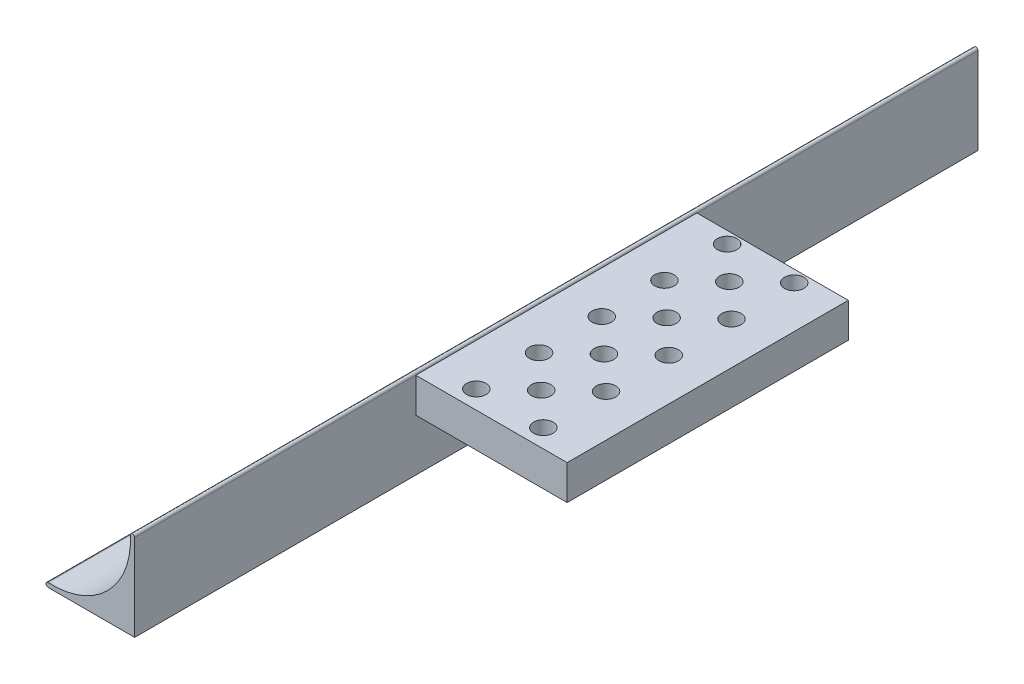
ISO-10303-21;
HEADER;
FILE_DESCRIPTION(('STEP AP214'),'2;1');
FILE_NAME('part.step','',(''),(''),'','','');
FILE_SCHEMA(('AUTOMOTIVE_DESIGN { 1 0 10303 214 1 1 1 1 }'));
ENDSEC;
DATA;
#1=APPLICATION_CONTEXT('core data for automotive mechanical design processes');
#2=APPLICATION_PROTOCOL_DEFINITION('international standard','automotive_design',2000,#1);
#3=PRODUCT_CONTEXT('',#1,'mechanical');
#4=PRODUCT('Part','Part','',(#3));
#5=PRODUCT_RELATED_PRODUCT_CATEGORY('part','',(#4));
#6=PRODUCT_DEFINITION_FORMATION('','',#4);
#7=PRODUCT_DEFINITION_CONTEXT('part definition',#1,'design');
#8=PRODUCT_DEFINITION('design','',#6,#7);
#9=PRODUCT_DEFINITION_SHAPE('','',#8);
#10=(LENGTH_UNIT() NAMED_UNIT(*) SI_UNIT(.MILLI.,.METRE.));
#11=(NAMED_UNIT(*) PLANE_ANGLE_UNIT() SI_UNIT($,.RADIAN.));
#12=(NAMED_UNIT(*) SI_UNIT($,.STERADIAN.) SOLID_ANGLE_UNIT());
#13=UNCERTAINTY_MEASURE_WITH_UNIT(LENGTH_MEASURE(1.E-05),#10,'distance_accuracy_value','');
#14=(GEOMETRIC_REPRESENTATION_CONTEXT(3) GLOBAL_UNCERTAINTY_ASSIGNED_CONTEXT((#13)) GLOBAL_UNIT_ASSIGNED_CONTEXT((#10,
#11,#12)) REPRESENTATION_CONTEXT('',''));
#15=CARTESIAN_POINT('',(0.,0.,0.));
#16=DIRECTION('',(0.,0.,1.));
#17=DIRECTION('',(1.,0.,0.));
#18=AXIS2_PLACEMENT_3D('',#15,#16,#17);
#19=CARTESIAN_POINT('',(0.,0.,97.5));
#20=DIRECTION('',(-1.,0.,0.));
#21=DIRECTION('',(0.,0.,1.));
#22=AXIS2_PLACEMENT_3D('',#19,#20,#21);
#23=PLANE('',#22);
#24=DIRECTION('',(0.,-1.,0.));
#25=VECTOR('',#24,1.);
#26=CARTESIAN_POINT('',(0.,20.,32.5));
#27=LINE('',#26,#25);
#28=CARTESIAN_POINT('',(0.,20.,32.5));
#29=VERTEX_POINT('',#28);
#30=CARTESIAN_POINT('',(0.,12.,32.5));
#31=VERTEX_POINT('',#30);
#32=EDGE_CURVE('E118',#29,#31,#27,.T.);
#33=ORIENTED_EDGE('',*,*,#32,.F.);
#34=DIRECTION('',(0.,0.,-1.));
#35=VECTOR('',#34,1.);
#36=CARTESIAN_POINT('',(0.,20.,97.5));
#37=LINE('',#36,#35);
#38=CARTESIAN_POINT('',(0.,20.,97.5));
#39=VERTEX_POINT('',#38);
#40=EDGE_CURVE('E115',#39,#29,#37,.T.);
#41=ORIENTED_EDGE('',*,*,#40,.F.);
#42=DIRECTION('',(0.,1.,0.));
#43=VECTOR('',#42,1.);
#44=CARTESIAN_POINT('',(0.,0.,97.5));
#45=LINE('',#44,#43);
#46=CARTESIAN_POINT('',(0.,0.,97.5));
#47=VERTEX_POINT('',#46);
#48=EDGE_CURVE('E104',#47,#39,#45,.T.);
#49=ORIENTED_EDGE('',*,*,#48,.F.);
#50=DIRECTION('',(0.,0.,-1.));
#51=VECTOR('',#50,1.);
#52=CARTESIAN_POINT('',(0.,0.,97.5));
#53=LINE('',#52,#51);
#54=CARTESIAN_POINT('',(0.,0.,-97.5));
#55=VERTEX_POINT('',#54);
#56=EDGE_CURVE('E48',#47,#55,#53,.T.);
#57=ORIENTED_EDGE('',*,*,#56,.T.);
#58=DIRECTION('',(0.,1.,0.));
#59=VECTOR('',#58,1.);
#60=CARTESIAN_POINT('',(0.,0.,-97.5));
#61=LINE('',#60,#59);
#62=CARTESIAN_POINT('',(0.,20.,-97.5));
#63=VERTEX_POINT('',#62);
#64=EDGE_CURVE('E136',#55,#63,#61,.T.);
#65=ORIENTED_EDGE('',*,*,#64,.T.);
#66=CARTESIAN_POINT('',(0.,20.,-32.5));
#67=VERTEX_POINT('',#66);
#68=EDGE_CURVE('E121',#67,#63,#37,.T.);
#69=ORIENTED_EDGE('',*,*,#68,.F.);
#70=DIRECTION('',(0.,1.,0.));
#71=VECTOR('',#70,1.);
#72=CARTESIAN_POINT('',(0.,20.,-32.5));
#73=LINE('',#72,#71);
#74=CARTESIAN_POINT('',(0.,12.,-32.5));
#75=VERTEX_POINT('',#74);
#76=EDGE_CURVE('E285',#75,#67,#73,.T.);
#77=ORIENTED_EDGE('',*,*,#76,.F.);
#78=DIRECTION('',(0.,0.,-1.));
#79=VECTOR('',#78,1.);
#80=CARTESIAN_POINT('',(0.,12.,32.5));
#81=LINE('',#80,#79);
#82=EDGE_CURVE('E282',#31,#75,#81,.T.);
#83=ORIENTED_EDGE('',*,*,#82,.F.);
#84=EDGE_LOOP('',(#33,#41,#49,#57,#65,#69,#77,#83));
#85=FACE_BOUND('',#84,.T.);
#86=ADVANCED_FACE('F39',(#85),#23,.F.);
#87=CARTESIAN_POINT('',(-20.,0.5,97.5));
#88=DIRECTION('',(0.,0.,-1.));
#89=DIRECTION('',(-1.,0.,0.));
#90=AXIS2_PLACEMENT_3D('',#87,#88,#89);
#91=CYLINDRICAL_SURFACE('',#90,0.5);
#92=CARTESIAN_POINT('',(-20.,0.5,-97.5));
#93=DIRECTION('',(0.,0.,1.));
#94=DIRECTION('',(1.,0.,0.));
#95=AXIS2_PLACEMENT_3D('',#92,#93,#94);
#96=CIRCLE('',#95,0.5);
#97=CARTESIAN_POINT('',(-19.9721995073313,0.999226534358279,-97.5));
#98=VERTEX_POINT('',#97);
#99=CARTESIAN_POINT('',(-20.,0.,-97.5));
#100=VERTEX_POINT('',#99);
#101=EDGE_CURVE('E130',#98,#100,#96,.T.);
#102=ORIENTED_EDGE('',*,*,#101,.T.);
#103=DIRECTION('',(0.,0.,-1.));
#104=VECTOR('',#103,1.);
#105=CARTESIAN_POINT('',(-20.,0.,97.5));
#106=LINE('',#105,#104);
#107=CARTESIAN_POINT('',(-20.,0.,97.5));
#108=VERTEX_POINT('',#107);
#109=EDGE_CURVE('E11',#108,#100,#106,.T.);
#110=ORIENTED_EDGE('',*,*,#109,.F.);
#111=CARTESIAN_POINT('',(-20.,0.5,97.5));
#112=DIRECTION('',(0.,0.,1.));
#113=DIRECTION('',(1.,0.,0.));
#114=AXIS2_PLACEMENT_3D('',#111,#112,#113);
#115=CIRCLE('',#114,0.5);
#116=CARTESIAN_POINT('',(-19.9721995073313,0.999226534358279,97.5));
#117=VERTEX_POINT('',#116);
#118=EDGE_CURVE('E142',#117,#108,#115,.T.);
#119=ORIENTED_EDGE('',*,*,#118,.F.);
#120=DIRECTION('',(0.,0.,-1.));
#121=VECTOR('',#120,1.);
#122=CARTESIAN_POINT('',(-19.9721995073313,0.999226534358279,97.5));
#123=LINE('',#122,#121);
#124=EDGE_CURVE('E126',#117,#98,#123,.T.);
#125=ORIENTED_EDGE('',*,*,#124,.T.);
#126=EDGE_LOOP('',(#102,#110,#119,#125));
#127=FACE_BOUND('',#126,.T.);
#128=ADVANCED_FACE('F41',(#127),#91,.T.);
#129=CARTESIAN_POINT('',(-20.,0.,97.5));
#130=DIRECTION('',(0.,1.,0.));
#131=DIRECTION('',(0.,0.,1.));
#132=AXIS2_PLACEMENT_3D('',#129,#130,#131);
#133=PLANE('',#132);
#134=DIRECTION('',(1.,0.,0.));
#135=VECTOR('',#134,1.);
#136=CARTESIAN_POINT('',(-20.,0.,-97.5));
#137=LINE('',#136,#135);
#138=EDGE_CURVE('E133',#100,#55,#137,.T.);
#139=ORIENTED_EDGE('',*,*,#138,.T.);
#140=ORIENTED_EDGE('',*,*,#56,.F.);
#141=DIRECTION('',(1.,0.,0.));
#142=VECTOR('',#141,1.);
#143=CARTESIAN_POINT('',(-20.,0.,97.5));
#144=LINE('',#143,#142);
#145=EDGE_CURVE('E97',#108,#47,#144,.T.);
#146=ORIENTED_EDGE('',*,*,#145,.F.);
#147=ORIENTED_EDGE('',*,*,#109,.T.);
#148=EDGE_LOOP('',(#139,#140,#146,#147));
#149=FACE_BOUND('',#148,.T.);
#150=ADVANCED_FACE('F300',(#149),#133,.F.);
#151=CARTESIAN_POINT('',(-0.5,20.,97.5));
#152=DIRECTION('',(0.,0.,-1.));
#153=DIRECTION('',(-1.,0.,0.));
#154=AXIS2_PLACEMENT_3D('',#151,#152,#153);
#155=CYLINDRICAL_SURFACE('',#154,0.5);
#156=CARTESIAN_POINT('',(-0.5,20.,-97.5));
#157=DIRECTION('',(0.,0.,1.));
#158=DIRECTION('',(1.,0.,0.));
#159=AXIS2_PLACEMENT_3D('',#156,#157,#158);
#160=CIRCLE('',#159,0.5);
#161=CARTESIAN_POINT('',(-0.999226534358276,19.9721995073313,-97.5));
#162=VERTEX_POINT('',#161);
#163=EDGE_CURVE('E139',#63,#162,#160,.T.);
#164=ORIENTED_EDGE('',*,*,#163,.T.);
#165=DIRECTION('',(0.,0.,-1.));
#166=VECTOR('',#165,1.);
#167=CARTESIAN_POINT('',(-0.999226534358276,19.9721995073313,97.5));
#168=LINE('',#167,#166);
#169=CARTESIAN_POINT('',(-0.999226534358276,19.9721995073313,97.5));
#170=VERTEX_POINT('',#169);
#171=EDGE_CURVE('E124',#170,#162,#168,.T.);
#172=ORIENTED_EDGE('',*,*,#171,.F.);
#173=CARTESIAN_POINT('',(-0.5,20.,97.5));
#174=DIRECTION('',(0.,0.,1.));
#175=DIRECTION('',(1.,0.,0.));
#176=AXIS2_PLACEMENT_3D('',#173,#174,#175);
#177=CIRCLE('',#176,0.5);
#178=EDGE_CURVE('E108',#39,#170,#177,.T.);
#179=ORIENTED_EDGE('',*,*,#178,.F.);
#180=ORIENTED_EDGE('',*,*,#40,.T.);
#181=DIRECTION('',(0.,0.,1.));
#182=VECTOR('',#181,1.);
#183=CARTESIAN_POINT('',(0.,20.,32.5));
#184=LINE('',#183,#182);
#185=EDGE_CURVE('E271',#67,#29,#184,.T.);
#186=ORIENTED_EDGE('',*,*,#185,.F.);
#187=ORIENTED_EDGE('',*,*,#68,.T.);
#188=EDGE_LOOP('',(#164,#172,#179,#180,#186,#187));
#189=FACE_BOUND('',#188,.T.);
#190=ADVANCED_FACE('F123',(#189),#155,.T.);
#191=CARTESIAN_POINT('',(-18.9713817712562,18.9713817712562,97.5));
#192=DIRECTION('',(0.,0.,-1.));
#193=DIRECTION('',(-1.,0.,0.));
#194=AXIS2_PLACEMENT_3D('',#191,#192,#193);
#195=CYLINDRICAL_SURFACE('',#194,18.);
#196=CARTESIAN_POINT('',(-18.9713817712562,18.9713817712562,-97.5));
#197=DIRECTION('',(0.,0.,-1.));
#198=DIRECTION('',(1.,0.,0.));
#199=AXIS2_PLACEMENT_3D('',#196,#197,#198);
#200=CIRCLE('',#199,18.);
#201=EDGE_CURVE('E89',#162,#98,#200,.T.);
#202=ORIENTED_EDGE('',*,*,#201,.T.);
#203=ORIENTED_EDGE('',*,*,#124,.F.);
#204=CARTESIAN_POINT('',(-18.9713817712562,18.9713817712562,97.5));
#205=DIRECTION('',(0.,0.,-1.));
#206=DIRECTION('',(1.,0.,0.));
#207=AXIS2_PLACEMENT_3D('',#204,#205,#206);
#208=CIRCLE('',#207,18.);
#209=EDGE_CURVE('E65',#170,#117,#208,.T.);
#210=ORIENTED_EDGE('',*,*,#209,.F.);
#211=ORIENTED_EDGE('',*,*,#171,.T.);
#212=EDGE_LOOP('',(#202,#203,#210,#211));
#213=FACE_BOUND('',#212,.T.);
#214=ADVANCED_FACE('F306',(#213),#195,.F.);
#215=CARTESIAN_POINT('',(-20.,0.5,97.5));
#216=DIRECTION('',(0.,0.,1.));
#217=DIRECTION('',(1.,0.,0.));
#218=AXIS2_PLACEMENT_3D('',#215,#216,#217);
#219=PLANE('',#218);
#220=ORIENTED_EDGE('',*,*,#118,.T.);
#221=ORIENTED_EDGE('',*,*,#145,.T.);
#222=ORIENTED_EDGE('',*,*,#48,.T.);
#223=ORIENTED_EDGE('',*,*,#178,.T.);
#224=ORIENTED_EDGE('',*,*,#209,.T.);
#225=EDGE_LOOP('',(#220,#221,#222,#223,#224));
#226=FACE_BOUND('',#225,.T.);
#227=ADVANCED_FACE('F106',(#226),#219,.T.);
#228=CARTESIAN_POINT('',(-20.,0.5,-97.5));
#229=DIRECTION('',(0.,0.,1.));
#230=DIRECTION('',(1.,0.,0.));
#231=AXIS2_PLACEMENT_3D('',#228,#229,#230);
#232=PLANE('',#231);
#233=ORIENTED_EDGE('',*,*,#101,.F.);
#234=ORIENTED_EDGE('',*,*,#201,.F.);
#235=ORIENTED_EDGE('',*,*,#163,.F.);
#236=ORIENTED_EDGE('',*,*,#64,.F.);
#237=ORIENTED_EDGE('',*,*,#138,.F.);
#238=EDGE_LOOP('',(#233,#234,#235,#236,#237));
#239=FACE_BOUND('',#238,.T.);
#240=ADVANCED_FACE('F305',(#239),#232,.F.);
#241=CARTESIAN_POINT('',(35.,20.,32.5));
#242=DIRECTION('',(0.,0.,-1.));
#243=DIRECTION('',(-1.,0.,0.));
#244=AXIS2_PLACEMENT_3D('',#241,#242,#243);
#245=PLANE('',#244);
#246=ORIENTED_EDGE('',*,*,#32,.T.);
#247=DIRECTION('',(-1.,0.,0.));
#248=VECTOR('',#247,1.);
#249=CARTESIAN_POINT('',(35.,12.,32.5));
#250=LINE('',#249,#248);
#251=CARTESIAN_POINT('',(35.,12.,32.5));
#252=VERTEX_POINT('',#251);
#253=EDGE_CURVE('E134',#252,#31,#250,.T.);
#254=ORIENTED_EDGE('',*,*,#253,.F.);
#255=DIRECTION('',(0.,-1.,0.));
#256=VECTOR('',#255,1.);
#257=CARTESIAN_POINT('',(35.,20.,32.5));
#258=LINE('',#257,#256);
#259=CARTESIAN_POINT('',(35.,20.,32.5));
#260=VERTEX_POINT('',#259);
#261=EDGE_CURVE('E267',#260,#252,#258,.T.);
#262=ORIENTED_EDGE('',*,*,#261,.F.);
#263=DIRECTION('',(-1.,0.,0.));
#264=VECTOR('',#263,1.);
#265=CARTESIAN_POINT('',(35.,20.,32.5));
#266=LINE('',#265,#264);
#267=EDGE_CURVE('E280',#260,#29,#266,.T.);
#268=ORIENTED_EDGE('',*,*,#267,.T.);
#269=EDGE_LOOP('',(#246,#254,#262,#268));
#270=FACE_BOUND('',#269,.T.);
#271=ADVANCED_FACE('F352',(#270),#245,.F.);
#272=CARTESIAN_POINT('',(35.,12.,32.5));
#273=DIRECTION('',(0.,1.,0.));
#274=DIRECTION('',(0.,0.,1.));
#275=AXIS2_PLACEMENT_3D('',#272,#273,#274);
#276=PLANE('',#275);
#277=CARTESIAN_POINT('',(9.75000000000002,12.,28.2500000000019));
#278=DIRECTION('',(0.,-1.,0.));
#279=DIRECTION('',(0.,0.,-1.));
#280=AXIS2_PLACEMENT_3D('',#277,#278,#279);
#281=CIRCLE('',#280,2.275);
#282=CARTESIAN_POINT('',(9.75000000000002,12.,25.9750000000019));
#283=VERTEX_POINT('',#282);
#284=EDGE_CURVE('E694',#283,#283,#281,.T.);
#285=ORIENTED_EDGE('',*,*,#284,.F.);
#286=EDGE_LOOP('',(#285));
#287=FACE_BOUND('',#286,.T.);
#288=CARTESIAN_POINT('',(25.25,12.,28.2500000000019));
#289=DIRECTION('',(0.,-1.,0.));
#290=DIRECTION('',(0.,0.,-1.));
#291=AXIS2_PLACEMENT_3D('',#288,#289,#290);
#292=CIRCLE('',#291,2.275);
#293=CARTESIAN_POINT('',(25.25,12.,25.9750000000019));
#294=VERTEX_POINT('',#293);
#295=EDGE_CURVE('E213',#294,#294,#292,.T.);
#296=ORIENTED_EDGE('',*,*,#295,.F.);
#297=EDGE_LOOP('',(#296));
#298=FACE_BOUND('',#297,.T.);
#299=CARTESIAN_POINT('',(25.25,12.,13.7500000000019));
#300=DIRECTION('',(0.,-1.,0.));
#301=DIRECTION('',(0.,0.,-1.));
#302=AXIS2_PLACEMENT_3D('',#299,#300,#301);
#303=CIRCLE('',#302,2.275);
#304=CARTESIAN_POINT('',(25.25,12.,11.4750000000019));
#305=VERTEX_POINT('',#304);
#306=EDGE_CURVE('E206',#305,#305,#303,.T.);
#307=ORIENTED_EDGE('',*,*,#306,.F.);
#308=EDGE_LOOP('',(#307));
#309=FACE_BOUND('',#308,.T.);
#310=CARTESIAN_POINT('',(17.5,12.,21.0000000000019));
#311=DIRECTION('',(0.,-1.,0.));
#312=DIRECTION('',(0.,0.,-1.));
#313=AXIS2_PLACEMENT_3D('',#310,#311,#312);
#314=CIRCLE('',#313,2.275);
#315=CARTESIAN_POINT('',(17.5,12.,18.7250000000019));
#316=VERTEX_POINT('',#315);
#317=EDGE_CURVE('E202',#316,#316,#314,.T.);
#318=ORIENTED_EDGE('',*,*,#317,.F.);
#319=EDGE_LOOP('',(#318));
#320=FACE_BOUND('',#319,.T.);
#321=CARTESIAN_POINT('',(9.75000000000002,12.,13.7500000000018));
#322=DIRECTION('',(0.,-1.,0.));
#323=DIRECTION('',(0.,0.,-1.));
#324=AXIS2_PLACEMENT_3D('',#321,#322,#323);
#325=CIRCLE('',#324,2.275);
#326=CARTESIAN_POINT('',(9.75000000000002,12.,11.4750000000018));
#327=VERTEX_POINT('',#326);
#328=EDGE_CURVE('E198',#327,#327,#325,.T.);
#329=ORIENTED_EDGE('',*,*,#328,.F.);
#330=EDGE_LOOP('',(#329));
#331=FACE_BOUND('',#330,.T.);
#332=CARTESIAN_POINT('',(9.75000000000002,12.,-0.749999999998138));
#333=DIRECTION('',(0.,-1.,0.));
#334=DIRECTION('',(0.,0.,-1.));
#335=AXIS2_PLACEMENT_3D('',#332,#333,#334);
#336=CIRCLE('',#335,2.275);
#337=CARTESIAN_POINT('',(9.75000000000002,12.,-3.02499999999814));
#338=VERTEX_POINT('',#337);
#339=EDGE_CURVE('E193',#338,#338,#336,.T.);
#340=ORIENTED_EDGE('',*,*,#339,.F.);
#341=EDGE_LOOP('',(#340));
#342=FACE_BOUND('',#341,.T.);
#343=CARTESIAN_POINT('',(25.25,12.,-0.749999999998297));
#344=DIRECTION('',(0.,-1.,0.));
#345=DIRECTION('',(0.,0.,-1.));
#346=AXIS2_PLACEMENT_3D('',#343,#344,#345);
#347=CIRCLE('',#346,2.275);
#348=CARTESIAN_POINT('',(25.25,12.,-3.0249999999983));
#349=VERTEX_POINT('',#348);
#350=EDGE_CURVE('E188',#349,#349,#347,.T.);
#351=ORIENTED_EDGE('',*,*,#350,.F.);
#352=EDGE_LOOP('',(#351));
#353=FACE_BOUND('',#352,.T.);
#354=CARTESIAN_POINT('',(17.5000000000001,12.,6.50000000000178));
#355=DIRECTION('',(0.,-1.,0.));
#356=DIRECTION('',(0.,0.,-1.));
#357=AXIS2_PLACEMENT_3D('',#354,#355,#356);
#358=CIRCLE('',#357,2.275);
#359=CARTESIAN_POINT('',(17.5000000000001,12.,4.22500000000178));
#360=VERTEX_POINT('',#359);
#361=EDGE_CURVE('E183',#360,#360,#358,.T.);
#362=ORIENTED_EDGE('',*,*,#361,.F.);
#363=EDGE_LOOP('',(#362));
#364=FACE_BOUND('',#363,.T.);
#365=CARTESIAN_POINT('',(17.5,12.,-7.9999999999983));
#366=DIRECTION('',(0.,-1.,0.));
#367=DIRECTION('',(0.,0.,-1.));
#368=AXIS2_PLACEMENT_3D('',#365,#366,#367);
#369=CIRCLE('',#368,2.275);
#370=CARTESIAN_POINT('',(17.5,12.,-10.2749999999983));
#371=VERTEX_POINT('',#370);
#372=EDGE_CURVE('E178',#371,#371,#369,.T.);
#373=ORIENTED_EDGE('',*,*,#372,.F.);
#374=EDGE_LOOP('',(#373));
#375=FACE_BOUND('',#374,.T.);
#376=CARTESIAN_POINT('',(9.75000000000012,12.,-15.2499999999981));
#377=DIRECTION('',(0.,-1.,0.));
#378=DIRECTION('',(0.,0.,-1.));
#379=AXIS2_PLACEMENT_3D('',#376,#377,#378);
#380=CIRCLE('',#379,2.275);
#381=CARTESIAN_POINT('',(9.75000000000012,12.,-17.5249999999981));
#382=VERTEX_POINT('',#381);
#383=EDGE_CURVE('E173',#382,#382,#380,.T.);
#384=ORIENTED_EDGE('',*,*,#383,.F.);
#385=EDGE_LOOP('',(#384));
#386=FACE_BOUND('',#385,.T.);
#387=CARTESIAN_POINT('',(25.2500000000002,12.,-15.2499999999981));
#388=DIRECTION('',(0.,-1.,0.));
#389=DIRECTION('',(0.,0.,-1.));
#390=AXIS2_PLACEMENT_3D('',#387,#388,#389);
#391=CIRCLE('',#390,2.275);
#392=CARTESIAN_POINT('',(25.2500000000002,12.,-17.5249999999981));
#393=VERTEX_POINT('',#392);
#394=EDGE_CURVE('E168',#393,#393,#391,.T.);
#395=ORIENTED_EDGE('',*,*,#394,.F.);
#396=EDGE_LOOP('',(#395));
#397=FACE_BOUND('',#396,.T.);
#398=CARTESIAN_POINT('',(9.75000000000002,12.,-29.7499999999981));
#399=DIRECTION('',(0.,-1.,0.));
#400=DIRECTION('',(0.,0.,-1.));
#401=AXIS2_PLACEMENT_3D('',#398,#399,#400);
#402=CIRCLE('',#401,2.275);
#403=CARTESIAN_POINT('',(9.75000000000002,12.,-32.0249999999981));
#404=VERTEX_POINT('',#403);
#405=EDGE_CURVE('E163',#404,#404,#402,.T.);
#406=ORIENTED_EDGE('',*,*,#405,.F.);
#407=EDGE_LOOP('',(#406));
#408=FACE_BOUND('',#407,.T.);
#409=CARTESIAN_POINT('',(17.5,12.,-22.4999999999981));
#410=DIRECTION('',(0.,-1.,0.));
#411=DIRECTION('',(0.,0.,-1.));
#412=AXIS2_PLACEMENT_3D('',#409,#410,#411);
#413=CIRCLE('',#412,2.275);
#414=CARTESIAN_POINT('',(17.5,12.,-24.7749999999981));
#415=VERTEX_POINT('',#414);
#416=EDGE_CURVE('E158',#415,#415,#413,.T.);
#417=ORIENTED_EDGE('',*,*,#416,.F.);
#418=EDGE_LOOP('',(#417));
#419=FACE_BOUND('',#418,.T.);
#420=CARTESIAN_POINT('',(25.2500000000001,12.,-29.7499999999981));
#421=DIRECTION('',(0.,-1.,0.));
#422=DIRECTION('',(0.,0.,-1.));
#423=AXIS2_PLACEMENT_3D('',#420,#421,#422);
#424=CIRCLE('',#423,2.275);
#425=CARTESIAN_POINT('',(25.2500000000001,12.,-32.0249999999981));
#426=VERTEX_POINT('',#425);
#427=EDGE_CURVE('E153',#426,#426,#424,.T.);
#428=ORIENTED_EDGE('',*,*,#427,.F.);
#429=EDGE_LOOP('',(#428));
#430=FACE_BOUND('',#429,.T.);
#431=ORIENTED_EDGE('',*,*,#82,.T.);
#432=DIRECTION('',(-1.,0.,0.));
#433=VECTOR('',#432,1.);
#434=CARTESIAN_POINT('',(35.,12.,-32.5));
#435=LINE('',#434,#433);
#436=CARTESIAN_POINT('',(35.,12.,-32.5));
#437=VERTEX_POINT('',#436);
#438=EDGE_CURVE('E291',#437,#75,#435,.T.);
#439=ORIENTED_EDGE('',*,*,#438,.F.);
#440=DIRECTION('',(0.,0.,-1.));
#441=VECTOR('',#440,1.);
#442=CARTESIAN_POINT('',(35.,12.,32.5));
#443=LINE('',#442,#441);
#444=EDGE_CURVE('E270',#252,#437,#443,.T.);
#445=ORIENTED_EDGE('',*,*,#444,.F.);
#446=ORIENTED_EDGE('',*,*,#253,.T.);
#447=EDGE_LOOP('',(#431,#439,#445,#446));
#448=FACE_BOUND('',#447,.T.);
#449=ADVANCED_FACE('F364',(#287,#298,#309,#320,#331,#342,#353,#364,#375,#386,#397,#408,#419,
#430,#448),#276,.F.);
#450=CARTESIAN_POINT('',(35.,20.,-32.5));
#451=DIRECTION('',(0.,0.,1.));
#452=DIRECTION('',(1.,0.,0.));
#453=AXIS2_PLACEMENT_3D('',#450,#451,#452);
#454=PLANE('',#453);
#455=ORIENTED_EDGE('',*,*,#76,.T.);
#456=DIRECTION('',(-1.,0.,0.));
#457=VECTOR('',#456,1.);
#458=CARTESIAN_POINT('',(35.,20.,-32.5));
#459=LINE('',#458,#457);
#460=CARTESIAN_POINT('',(35.,20.,-32.5));
#461=VERTEX_POINT('',#460);
#462=EDGE_CURVE('E56',#461,#67,#459,.T.);
#463=ORIENTED_EDGE('',*,*,#462,.F.);
#464=DIRECTION('',(0.,1.,0.));
#465=VECTOR('',#464,1.);
#466=CARTESIAN_POINT('',(35.,20.,-32.5));
#467=LINE('',#466,#465);
#468=EDGE_CURVE('E274',#437,#461,#467,.T.);
#469=ORIENTED_EDGE('',*,*,#468,.F.);
#470=ORIENTED_EDGE('',*,*,#438,.T.);
#471=EDGE_LOOP('',(#455,#463,#469,#470));
#472=FACE_BOUND('',#471,.T.);
#473=ADVANCED_FACE('F373',(#472),#454,.F.);
#474=CARTESIAN_POINT('',(35.,20.,32.5));
#475=DIRECTION('',(0.,-1.,0.));
#476=DIRECTION('',(0.,0.,-1.));
#477=AXIS2_PLACEMENT_3D('',#474,#475,#476);
#478=PLANE('',#477);
#479=CARTESIAN_POINT('',(9.75000000000002,20.,28.2500000000019));
#480=DIRECTION('',(0.,-1.,0.));
#481=DIRECTION('',(0.,0.,-1.));
#482=AXIS2_PLACEMENT_3D('',#479,#480,#481);
#483=CIRCLE('',#482,2.25);
#484=CARTESIAN_POINT('',(9.75000000000002,20.,26.0000000000019));
#485=VERTEX_POINT('',#484);
#486=EDGE_CURVE('E43',#485,#485,#483,.T.);
#487=ORIENTED_EDGE('',*,*,#486,.T.);
#488=EDGE_LOOP('',(#487));
#489=FACE_BOUND('',#488,.T.);
#490=CARTESIAN_POINT('',(25.25,20.,28.2500000000019));
#491=DIRECTION('',(0.,-1.,0.));
#492=DIRECTION('',(0.,0.,-1.));
#493=AXIS2_PLACEMENT_3D('',#490,#491,#492);
#494=CIRCLE('',#493,2.25);
#495=CARTESIAN_POINT('',(25.25,20.,26.0000000000019));
#496=VERTEX_POINT('',#495);
#497=EDGE_CURVE('E204',#496,#496,#494,.T.);
#498=ORIENTED_EDGE('',*,*,#497,.T.);
#499=EDGE_LOOP('',(#498));
#500=FACE_BOUND('',#499,.T.);
#501=CARTESIAN_POINT('',(25.25,20.,13.7500000000019));
#502=DIRECTION('',(0.,-1.,0.));
#503=DIRECTION('',(0.,0.,-1.));
#504=AXIS2_PLACEMENT_3D('',#501,#502,#503);
#505=CIRCLE('',#504,2.25);
#506=CARTESIAN_POINT('',(25.25,20.,11.5000000000019));
#507=VERTEX_POINT('',#506);
#508=EDGE_CURVE('E200',#507,#507,#505,.T.);
#509=ORIENTED_EDGE('',*,*,#508,.T.);
#510=EDGE_LOOP('',(#509));
#511=FACE_BOUND('',#510,.T.);
#512=CARTESIAN_POINT('',(17.5,20.,21.0000000000019));
#513=DIRECTION('',(0.,-1.,0.));
#514=DIRECTION('',(0.,0.,-1.));
#515=AXIS2_PLACEMENT_3D('',#512,#513,#514);
#516=CIRCLE('',#515,2.25);
#517=CARTESIAN_POINT('',(17.5,20.,18.7500000000019));
#518=VERTEX_POINT('',#517);
#519=EDGE_CURVE('E195',#518,#518,#516,.T.);
#520=ORIENTED_EDGE('',*,*,#519,.T.);
#521=EDGE_LOOP('',(#520));
#522=FACE_BOUND('',#521,.T.);
#523=CARTESIAN_POINT('',(9.75000000000002,20.,13.7500000000018));
#524=DIRECTION('',(0.,-1.,0.));
#525=DIRECTION('',(0.,0.,-1.));
#526=AXIS2_PLACEMENT_3D('',#523,#524,#525);
#527=CIRCLE('',#526,2.25);
#528=CARTESIAN_POINT('',(9.75000000000002,20.,11.5000000000018));
#529=VERTEX_POINT('',#528);
#530=EDGE_CURVE('E190',#529,#529,#527,.T.);
#531=ORIENTED_EDGE('',*,*,#530,.T.);
#532=EDGE_LOOP('',(#531));
#533=FACE_BOUND('',#532,.T.);
#534=CARTESIAN_POINT('',(9.75000000000002,20.,-0.749999999998138));
#535=DIRECTION('',(0.,-1.,0.));
#536=DIRECTION('',(0.,0.,-1.));
#537=AXIS2_PLACEMENT_3D('',#534,#535,#536);
#538=CIRCLE('',#537,2.25);
#539=CARTESIAN_POINT('',(9.75000000000002,20.,-2.99999999999814));
#540=VERTEX_POINT('',#539);
#541=EDGE_CURVE('E185',#540,#540,#538,.T.);
#542=ORIENTED_EDGE('',*,*,#541,.T.);
#543=EDGE_LOOP('',(#542));
#544=FACE_BOUND('',#543,.T.);
#545=CARTESIAN_POINT('',(25.25,20.,-0.749999999998297));
#546=DIRECTION('',(0.,-1.,0.));
#547=DIRECTION('',(0.,0.,-1.));
#548=AXIS2_PLACEMENT_3D('',#545,#546,#547);
#549=CIRCLE('',#548,2.25);
#550=CARTESIAN_POINT('',(25.25,20.,-2.9999999999983));
#551=VERTEX_POINT('',#550);
#552=EDGE_CURVE('E180',#551,#551,#549,.T.);
#553=ORIENTED_EDGE('',*,*,#552,.T.);
#554=EDGE_LOOP('',(#553));
#555=FACE_BOUND('',#554,.T.);
#556=CARTESIAN_POINT('',(17.5000000000001,20.,6.50000000000178));
#557=DIRECTION('',(0.,-1.,0.));
#558=DIRECTION('',(0.,0.,-1.));
#559=AXIS2_PLACEMENT_3D('',#556,#557,#558);
#560=CIRCLE('',#559,2.25);
#561=CARTESIAN_POINT('',(17.5000000000001,20.,4.25000000000178));
#562=VERTEX_POINT('',#561);
#563=EDGE_CURVE('E175',#562,#562,#560,.T.);
#564=ORIENTED_EDGE('',*,*,#563,.T.);
#565=EDGE_LOOP('',(#564));
#566=FACE_BOUND('',#565,.T.);
#567=CARTESIAN_POINT('',(17.5,20.,-7.9999999999983));
#568=DIRECTION('',(0.,-1.,0.));
#569=DIRECTION('',(0.,0.,-1.));
#570=AXIS2_PLACEMENT_3D('',#567,#568,#569);
#571=CIRCLE('',#570,2.25);
#572=CARTESIAN_POINT('',(17.5,20.,-10.2499999999983));
#573=VERTEX_POINT('',#572);
#574=EDGE_CURVE('E170',#573,#573,#571,.T.);
#575=ORIENTED_EDGE('',*,*,#574,.T.);
#576=EDGE_LOOP('',(#575));
#577=FACE_BOUND('',#576,.T.);
#578=CARTESIAN_POINT('',(9.75000000000012,20.,-15.2499999999981));
#579=DIRECTION('',(0.,-1.,0.));
#580=DIRECTION('',(0.,0.,-1.));
#581=AXIS2_PLACEMENT_3D('',#578,#579,#580);
#582=CIRCLE('',#581,2.25);
#583=CARTESIAN_POINT('',(9.75000000000012,20.,-17.4999999999981));
#584=VERTEX_POINT('',#583);
#585=EDGE_CURVE('E165',#584,#584,#582,.T.);
#586=ORIENTED_EDGE('',*,*,#585,.T.);
#587=EDGE_LOOP('',(#586));
#588=FACE_BOUND('',#587,.T.);
#589=CARTESIAN_POINT('',(25.2500000000002,20.,-15.2499999999981));
#590=DIRECTION('',(0.,-1.,0.));
#591=DIRECTION('',(0.,0.,-1.));
#592=AXIS2_PLACEMENT_3D('',#589,#590,#591);
#593=CIRCLE('',#592,2.25);
#594=CARTESIAN_POINT('',(25.2500000000002,20.,-17.4999999999981));
#595=VERTEX_POINT('',#594);
#596=EDGE_CURVE('E160',#595,#595,#593,.T.);
#597=ORIENTED_EDGE('',*,*,#596,.T.);
#598=EDGE_LOOP('',(#597));
#599=FACE_BOUND('',#598,.T.);
#600=CARTESIAN_POINT('',(9.75000000000002,20.,-29.7499999999981));
#601=DIRECTION('',(0.,-1.,0.));
#602=DIRECTION('',(0.,0.,-1.));
#603=AXIS2_PLACEMENT_3D('',#600,#601,#602);
#604=CIRCLE('',#603,2.25);
#605=CARTESIAN_POINT('',(9.75000000000002,20.,-31.9999999999981));
#606=VERTEX_POINT('',#605);
#607=EDGE_CURVE('E155',#606,#606,#604,.T.);
#608=ORIENTED_EDGE('',*,*,#607,.T.);
#609=EDGE_LOOP('',(#608));
#610=FACE_BOUND('',#609,.T.);
#611=CARTESIAN_POINT('',(17.5,20.,-22.4999999999981));
#612=DIRECTION('',(0.,-1.,0.));
#613=DIRECTION('',(0.,0.,-1.));
#614=AXIS2_PLACEMENT_3D('',#611,#612,#613);
#615=CIRCLE('',#614,2.25);
#616=CARTESIAN_POINT('',(17.5,20.,-24.7499999999981));
#617=VERTEX_POINT('',#616);
#618=EDGE_CURVE('E150',#617,#617,#615,.T.);
#619=ORIENTED_EDGE('',*,*,#618,.T.);
#620=EDGE_LOOP('',(#619));
#621=FACE_BOUND('',#620,.T.);
#622=CARTESIAN_POINT('',(25.2500000000001,20.,-29.7499999999981));
#623=DIRECTION('',(0.,-1.,0.));
#624=DIRECTION('',(0.,0.,-1.));
#625=AXIS2_PLACEMENT_3D('',#622,#623,#624);
#626=CIRCLE('',#625,2.25);
#627=CARTESIAN_POINT('',(25.2500000000001,20.,-31.9999999999981));
#628=VERTEX_POINT('',#627);
#629=EDGE_CURVE('E146',#628,#628,#626,.T.);
#630=ORIENTED_EDGE('',*,*,#629,.T.);
#631=EDGE_LOOP('',(#630));
#632=FACE_BOUND('',#631,.T.);
#633=ORIENTED_EDGE('',*,*,#185,.T.);
#634=ORIENTED_EDGE('',*,*,#267,.F.);
#635=DIRECTION('',(0.,0.,1.));
#636=VECTOR('',#635,1.);
#637=CARTESIAN_POINT('',(35.,20.,32.5));
#638=LINE('',#637,#636);
#639=EDGE_CURVE('E277',#461,#260,#638,.T.);
#640=ORIENTED_EDGE('',*,*,#639,.F.);
#641=ORIENTED_EDGE('',*,*,#462,.T.);
#642=EDGE_LOOP('',(#633,#634,#640,#641));
#643=FACE_BOUND('',#642,.T.);
#644=ADVANCED_FACE('F382',(#489,#500,#511,#522,#533,#544,#555,#566,#577,#588,#599,#610,#621,
#632,#643),#478,.F.);
#645=CARTESIAN_POINT('',(35.,0.,0.));
#646=DIRECTION('',(1.,0.,0.));
#647=DIRECTION('',(0.,0.,-1.));
#648=AXIS2_PLACEMENT_3D('',#645,#646,#647);
#649=PLANE('',#648);
#650=ORIENTED_EDGE('',*,*,#261,.T.);
#651=ORIENTED_EDGE('',*,*,#444,.T.);
#652=ORIENTED_EDGE('',*,*,#468,.T.);
#653=ORIENTED_EDGE('',*,*,#639,.T.);
#654=EDGE_LOOP('',(#650,#651,#652,#653));
#655=FACE_BOUND('',#654,.T.);
#656=ADVANCED_FACE('F391',(#655),#649,.T.);
#657=CARTESIAN_POINT('',(25.2500000000001,12.,-29.7499999999981));
#658=DIRECTION('',(0.,-1.,0.));
#659=DIRECTION('',(0.,0.,-1.));
#660=AXIS2_PLACEMENT_3D('',#657,#658,#659);
#661=CYLINDRICAL_SURFACE('',#660,2.25);
#662=CARTESIAN_POINT('',(25.2500000000001,12.025,-29.7499999999981));
#663=DIRECTION('',(0.,-1.,0.));
#664=DIRECTION('',(0.,0.,-1.));
#665=AXIS2_PLACEMENT_3D('',#662,#663,#664);
#666=CIRCLE('',#665,2.25);
#667=CARTESIAN_POINT('',(25.2500000000001,12.025,-31.9999999999981));
#668=VERTEX_POINT('',#667);
#669=EDGE_CURVE('E149',#668,#668,#666,.T.);
#670=ORIENTED_EDGE('',*,*,#669,.T.);
#671=EDGE_LOOP('',(#670));
#672=FACE_BOUND('',#671,.T.);
#673=ORIENTED_EDGE('',*,*,#629,.F.);
#674=EDGE_LOOP('',(#673));
#675=FACE_BOUND('',#674,.T.);
#676=ADVANCED_FACE('F400',(#672,#675),#661,.F.);
#677=CARTESIAN_POINT('',(25.2500000000001,12.,-29.7499999999981));
#678=DIRECTION('',(0.,-1.,0.));
#679=DIRECTION('',(0.,0.,-1.));
#680=AXIS2_PLACEMENT_3D('',#677,#678,#679);
#681=CONICAL_SURFACE('',#680,2.275,0.785398163397448);
#682=ORIENTED_EDGE('',*,*,#669,.F.);
#683=EDGE_LOOP('',(#682));
#684=FACE_BOUND('',#683,.T.);
#685=ORIENTED_EDGE('',*,*,#427,.T.);
#686=EDGE_LOOP('',(#685));
#687=FACE_BOUND('',#686,.T.);
#688=ADVANCED_FACE('F409',(#684,#687),#681,.F.);
#689=CARTESIAN_POINT('',(17.5,12.,-22.4999999999981));
#690=DIRECTION('',(0.,-1.,0.));
#691=DIRECTION('',(0.,0.,-1.));
#692=AXIS2_PLACEMENT_3D('',#689,#690,#691);
#693=CYLINDRICAL_SURFACE('',#692,2.25);
#694=CARTESIAN_POINT('',(17.5,12.025,-22.4999999999981));
#695=DIRECTION('',(0.,-1.,0.));
#696=DIRECTION('',(0.,0.,-1.));
#697=AXIS2_PLACEMENT_3D('',#694,#695,#696);
#698=CIRCLE('',#697,2.25);
#699=CARTESIAN_POINT('',(17.5,12.025,-24.7499999999981));
#700=VERTEX_POINT('',#699);
#701=EDGE_CURVE('E154',#700,#700,#698,.T.);
#702=ORIENTED_EDGE('',*,*,#701,.T.);
#703=EDGE_LOOP('',(#702));
#704=FACE_BOUND('',#703,.T.);
#705=ORIENTED_EDGE('',*,*,#618,.F.);
#706=EDGE_LOOP('',(#705));
#707=FACE_BOUND('',#706,.T.);
#708=ADVANCED_FACE('F418',(#704,#707),#693,.F.);
#709=CARTESIAN_POINT('',(17.5,12.,-22.4999999999981));
#710=DIRECTION('',(0.,-1.,0.));
#711=DIRECTION('',(0.,0.,-1.));
#712=AXIS2_PLACEMENT_3D('',#709,#710,#711);
#713=CONICAL_SURFACE('',#712,2.275,0.785398163397448);
#714=ORIENTED_EDGE('',*,*,#701,.F.);
#715=EDGE_LOOP('',(#714));
#716=FACE_BOUND('',#715,.T.);
#717=ORIENTED_EDGE('',*,*,#416,.T.);
#718=EDGE_LOOP('',(#717));
#719=FACE_BOUND('',#718,.T.);
#720=ADVANCED_FACE('F427',(#716,#719),#713,.F.);
#721=CARTESIAN_POINT('',(9.75000000000002,12.,-29.7499999999981));
#722=DIRECTION('',(0.,-1.,0.));
#723=DIRECTION('',(0.,0.,-1.));
#724=AXIS2_PLACEMENT_3D('',#721,#722,#723);
#725=CYLINDRICAL_SURFACE('',#724,2.25);
#726=CARTESIAN_POINT('',(9.75000000000002,12.025,-29.7499999999981));
#727=DIRECTION('',(0.,-1.,0.));
#728=DIRECTION('',(0.,0.,-1.));
#729=AXIS2_PLACEMENT_3D('',#726,#727,#728);
#730=CIRCLE('',#729,2.25);
#731=CARTESIAN_POINT('',(9.75000000000002,12.025,-31.9999999999981));
#732=VERTEX_POINT('',#731);
#733=EDGE_CURVE('E159',#732,#732,#730,.T.);
#734=ORIENTED_EDGE('',*,*,#733,.T.);
#735=EDGE_LOOP('',(#734));
#736=FACE_BOUND('',#735,.T.);
#737=ORIENTED_EDGE('',*,*,#607,.F.);
#738=EDGE_LOOP('',(#737));
#739=FACE_BOUND('',#738,.T.);
#740=ADVANCED_FACE('F436',(#736,#739),#725,.F.);
#741=CARTESIAN_POINT('',(9.75000000000002,12.,-29.7499999999981));
#742=DIRECTION('',(0.,-1.,0.));
#743=DIRECTION('',(0.,0.,-1.));
#744=AXIS2_PLACEMENT_3D('',#741,#742,#743);
#745=CONICAL_SURFACE('',#744,2.275,0.785398163397448);
#746=ORIENTED_EDGE('',*,*,#733,.F.);
#747=EDGE_LOOP('',(#746));
#748=FACE_BOUND('',#747,.T.);
#749=ORIENTED_EDGE('',*,*,#405,.T.);
#750=EDGE_LOOP('',(#749));
#751=FACE_BOUND('',#750,.T.);
#752=ADVANCED_FACE('F445',(#748,#751),#745,.F.);
#753=CARTESIAN_POINT('',(25.2500000000002,12.,-15.2499999999981));
#754=DIRECTION('',(0.,-1.,0.));
#755=DIRECTION('',(0.,0.,-1.));
#756=AXIS2_PLACEMENT_3D('',#753,#754,#755);
#757=CYLINDRICAL_SURFACE('',#756,2.25);
#758=CARTESIAN_POINT('',(25.2500000000002,12.025,-15.2499999999981));
#759=DIRECTION('',(0.,-1.,0.));
#760=DIRECTION('',(0.,0.,-1.));
#761=AXIS2_PLACEMENT_3D('',#758,#759,#760);
#762=CIRCLE('',#761,2.25);
#763=CARTESIAN_POINT('',(25.2500000000002,12.025,-17.4999999999981));
#764=VERTEX_POINT('',#763);
#765=EDGE_CURVE('E164',#764,#764,#762,.T.);
#766=ORIENTED_EDGE('',*,*,#765,.T.);
#767=EDGE_LOOP('',(#766));
#768=FACE_BOUND('',#767,.T.);
#769=ORIENTED_EDGE('',*,*,#596,.F.);
#770=EDGE_LOOP('',(#769));
#771=FACE_BOUND('',#770,.T.);
#772=ADVANCED_FACE('F454',(#768,#771),#757,.F.);
#773=CARTESIAN_POINT('',(25.2500000000002,12.,-15.2499999999981));
#774=DIRECTION('',(0.,-1.,0.));
#775=DIRECTION('',(0.,0.,-1.));
#776=AXIS2_PLACEMENT_3D('',#773,#774,#775);
#777=CONICAL_SURFACE('',#776,2.275,0.785398163397448);
#778=ORIENTED_EDGE('',*,*,#765,.F.);
#779=EDGE_LOOP('',(#778));
#780=FACE_BOUND('',#779,.T.);
#781=ORIENTED_EDGE('',*,*,#394,.T.);
#782=EDGE_LOOP('',(#781));
#783=FACE_BOUND('',#782,.T.);
#784=ADVANCED_FACE('F463',(#780,#783),#777,.F.);
#785=CARTESIAN_POINT('',(9.75000000000012,12.,-15.2499999999981));
#786=DIRECTION('',(0.,-1.,0.));
#787=DIRECTION('',(0.,0.,-1.));
#788=AXIS2_PLACEMENT_3D('',#785,#786,#787);
#789=CYLINDRICAL_SURFACE('',#788,2.25);
#790=CARTESIAN_POINT('',(9.75000000000012,12.025,-15.2499999999981));
#791=DIRECTION('',(0.,-1.,0.));
#792=DIRECTION('',(0.,0.,-1.));
#793=AXIS2_PLACEMENT_3D('',#790,#791,#792);
#794=CIRCLE('',#793,2.25);
#795=CARTESIAN_POINT('',(9.75000000000012,12.025,-17.4999999999981));
#796=VERTEX_POINT('',#795);
#797=EDGE_CURVE('E169',#796,#796,#794,.T.);
#798=ORIENTED_EDGE('',*,*,#797,.T.);
#799=EDGE_LOOP('',(#798));
#800=FACE_BOUND('',#799,.T.);
#801=ORIENTED_EDGE('',*,*,#585,.F.);
#802=EDGE_LOOP('',(#801));
#803=FACE_BOUND('',#802,.T.);
#804=ADVANCED_FACE('F472',(#800,#803),#789,.F.);
#805=CARTESIAN_POINT('',(9.75000000000012,12.,-15.2499999999981));
#806=DIRECTION('',(0.,-1.,0.));
#807=DIRECTION('',(0.,0.,-1.));
#808=AXIS2_PLACEMENT_3D('',#805,#806,#807);
#809=CONICAL_SURFACE('',#808,2.275,0.785398163397448);
#810=ORIENTED_EDGE('',*,*,#797,.F.);
#811=EDGE_LOOP('',(#810));
#812=FACE_BOUND('',#811,.T.);
#813=ORIENTED_EDGE('',*,*,#383,.T.);
#814=EDGE_LOOP('',(#813));
#815=FACE_BOUND('',#814,.T.);
#816=ADVANCED_FACE('F481',(#812,#815),#809,.F.);
#817=CARTESIAN_POINT('',(17.5,12.,-7.9999999999983));
#818=DIRECTION('',(0.,-1.,0.));
#819=DIRECTION('',(0.,0.,-1.));
#820=AXIS2_PLACEMENT_3D('',#817,#818,#819);
#821=CYLINDRICAL_SURFACE('',#820,2.25);
#822=CARTESIAN_POINT('',(17.5,12.025,-7.9999999999983));
#823=DIRECTION('',(0.,-1.,0.));
#824=DIRECTION('',(0.,0.,-1.));
#825=AXIS2_PLACEMENT_3D('',#822,#823,#824);
#826=CIRCLE('',#825,2.25);
#827=CARTESIAN_POINT('',(17.5,12.025,-10.2499999999983));
#828=VERTEX_POINT('',#827);
#829=EDGE_CURVE('E174',#828,#828,#826,.T.);
#830=ORIENTED_EDGE('',*,*,#829,.T.);
#831=EDGE_LOOP('',(#830));
#832=FACE_BOUND('',#831,.T.);
#833=ORIENTED_EDGE('',*,*,#574,.F.);
#834=EDGE_LOOP('',(#833));
#835=FACE_BOUND('',#834,.T.);
#836=ADVANCED_FACE('F490',(#832,#835),#821,.F.);
#837=CARTESIAN_POINT('',(17.5,12.,-7.9999999999983));
#838=DIRECTION('',(0.,-1.,0.));
#839=DIRECTION('',(0.,0.,-1.));
#840=AXIS2_PLACEMENT_3D('',#837,#838,#839);
#841=CONICAL_SURFACE('',#840,2.275,0.785398163397448);
#842=ORIENTED_EDGE('',*,*,#829,.F.);
#843=EDGE_LOOP('',(#842));
#844=FACE_BOUND('',#843,.T.);
#845=ORIENTED_EDGE('',*,*,#372,.T.);
#846=EDGE_LOOP('',(#845));
#847=FACE_BOUND('',#846,.T.);
#848=ADVANCED_FACE('F499',(#844,#847),#841,.F.);
#849=CARTESIAN_POINT('',(17.5000000000001,12.,6.50000000000178));
#850=DIRECTION('',(0.,-1.,0.));
#851=DIRECTION('',(0.,0.,-1.));
#852=AXIS2_PLACEMENT_3D('',#849,#850,#851);
#853=CYLINDRICAL_SURFACE('',#852,2.25);
#854=CARTESIAN_POINT('',(17.5000000000001,12.025,6.50000000000178));
#855=DIRECTION('',(0.,-1.,0.));
#856=DIRECTION('',(0.,0.,-1.));
#857=AXIS2_PLACEMENT_3D('',#854,#855,#856);
#858=CIRCLE('',#857,2.25);
#859=CARTESIAN_POINT('',(17.5000000000001,12.025,4.25000000000178));
#860=VERTEX_POINT('',#859);
#861=EDGE_CURVE('E179',#860,#860,#858,.T.);
#862=ORIENTED_EDGE('',*,*,#861,.T.);
#863=EDGE_LOOP('',(#862));
#864=FACE_BOUND('',#863,.T.);
#865=ORIENTED_EDGE('',*,*,#563,.F.);
#866=EDGE_LOOP('',(#865));
#867=FACE_BOUND('',#866,.T.);
#868=ADVANCED_FACE('F508',(#864,#867),#853,.F.);
#869=CARTESIAN_POINT('',(17.5000000000001,12.,6.50000000000178));
#870=DIRECTION('',(0.,-1.,0.));
#871=DIRECTION('',(0.,0.,-1.));
#872=AXIS2_PLACEMENT_3D('',#869,#870,#871);
#873=CONICAL_SURFACE('',#872,2.275,0.785398163397448);
#874=ORIENTED_EDGE('',*,*,#861,.F.);
#875=EDGE_LOOP('',(#874));
#876=FACE_BOUND('',#875,.T.);
#877=ORIENTED_EDGE('',*,*,#361,.T.);
#878=EDGE_LOOP('',(#877));
#879=FACE_BOUND('',#878,.T.);
#880=ADVANCED_FACE('F517',(#876,#879),#873,.F.);
#881=CARTESIAN_POINT('',(25.25,12.,-0.749999999998297));
#882=DIRECTION('',(0.,-1.,0.));
#883=DIRECTION('',(0.,0.,-1.));
#884=AXIS2_PLACEMENT_3D('',#881,#882,#883);
#885=CYLINDRICAL_SURFACE('',#884,2.25);
#886=CARTESIAN_POINT('',(25.25,12.025,-0.749999999998297));
#887=DIRECTION('',(0.,-1.,0.));
#888=DIRECTION('',(0.,0.,-1.));
#889=AXIS2_PLACEMENT_3D('',#886,#887,#888);
#890=CIRCLE('',#889,2.25);
#891=CARTESIAN_POINT('',(25.25,12.025,-2.9999999999983));
#892=VERTEX_POINT('',#891);
#893=EDGE_CURVE('E184',#892,#892,#890,.T.);
#894=ORIENTED_EDGE('',*,*,#893,.T.);
#895=EDGE_LOOP('',(#894));
#896=FACE_BOUND('',#895,.T.);
#897=ORIENTED_EDGE('',*,*,#552,.F.);
#898=EDGE_LOOP('',(#897));
#899=FACE_BOUND('',#898,.T.);
#900=ADVANCED_FACE('F526',(#896,#899),#885,.F.);
#901=CARTESIAN_POINT('',(25.25,12.,-0.749999999998297));
#902=DIRECTION('',(0.,-1.,0.));
#903=DIRECTION('',(0.,0.,-1.));
#904=AXIS2_PLACEMENT_3D('',#901,#902,#903);
#905=CONICAL_SURFACE('',#904,2.275,0.785398163397448);
#906=ORIENTED_EDGE('',*,*,#893,.F.);
#907=EDGE_LOOP('',(#906));
#908=FACE_BOUND('',#907,.T.);
#909=ORIENTED_EDGE('',*,*,#350,.T.);
#910=EDGE_LOOP('',(#909));
#911=FACE_BOUND('',#910,.T.);
#912=ADVANCED_FACE('F535',(#908,#911),#905,.F.);
#913=CARTESIAN_POINT('',(9.75000000000002,12.,-0.749999999998138));
#914=DIRECTION('',(0.,-1.,0.));
#915=DIRECTION('',(0.,0.,-1.));
#916=AXIS2_PLACEMENT_3D('',#913,#914,#915);
#917=CYLINDRICAL_SURFACE('',#916,2.25);
#918=CARTESIAN_POINT('',(9.75000000000002,12.025,-0.749999999998138));
#919=DIRECTION('',(0.,-1.,0.));
#920=DIRECTION('',(0.,0.,-1.));
#921=AXIS2_PLACEMENT_3D('',#918,#919,#920);
#922=CIRCLE('',#921,2.25);
#923=CARTESIAN_POINT('',(9.75000000000002,12.025,-2.99999999999814));
#924=VERTEX_POINT('',#923);
#925=EDGE_CURVE('E189',#924,#924,#922,.T.);
#926=ORIENTED_EDGE('',*,*,#925,.T.);
#927=EDGE_LOOP('',(#926));
#928=FACE_BOUND('',#927,.T.);
#929=ORIENTED_EDGE('',*,*,#541,.F.);
#930=EDGE_LOOP('',(#929));
#931=FACE_BOUND('',#930,.T.);
#932=ADVANCED_FACE('F544',(#928,#931),#917,.F.);
#933=CARTESIAN_POINT('',(9.75000000000002,12.,-0.749999999998138));
#934=DIRECTION('',(0.,-1.,0.));
#935=DIRECTION('',(0.,0.,-1.));
#936=AXIS2_PLACEMENT_3D('',#933,#934,#935);
#937=CONICAL_SURFACE('',#936,2.275,0.785398163397448);
#938=ORIENTED_EDGE('',*,*,#925,.F.);
#939=EDGE_LOOP('',(#938));
#940=FACE_BOUND('',#939,.T.);
#941=ORIENTED_EDGE('',*,*,#339,.T.);
#942=EDGE_LOOP('',(#941));
#943=FACE_BOUND('',#942,.T.);
#944=ADVANCED_FACE('F553',(#940,#943),#937,.F.);
#945=CARTESIAN_POINT('',(9.75000000000002,12.,13.7500000000018));
#946=DIRECTION('',(0.,-1.,0.));
#947=DIRECTION('',(0.,0.,-1.));
#948=AXIS2_PLACEMENT_3D('',#945,#946,#947);
#949=CYLINDRICAL_SURFACE('',#948,2.25);
#950=CARTESIAN_POINT('',(9.75000000000002,12.025,13.7500000000018));
#951=DIRECTION('',(0.,-1.,0.));
#952=DIRECTION('',(0.,0.,-1.));
#953=AXIS2_PLACEMENT_3D('',#950,#951,#952);
#954=CIRCLE('',#953,2.25);
#955=CARTESIAN_POINT('',(9.75000000000002,12.025,11.5000000000018));
#956=VERTEX_POINT('',#955);
#957=EDGE_CURVE('E194',#956,#956,#954,.T.);
#958=ORIENTED_EDGE('',*,*,#957,.T.);
#959=EDGE_LOOP('',(#958));
#960=FACE_BOUND('',#959,.T.);
#961=ORIENTED_EDGE('',*,*,#530,.F.);
#962=EDGE_LOOP('',(#961));
#963=FACE_BOUND('',#962,.T.);
#964=ADVANCED_FACE('F562',(#960,#963),#949,.F.);
#965=CARTESIAN_POINT('',(9.75000000000002,12.,13.7500000000018));
#966=DIRECTION('',(0.,-1.,0.));
#967=DIRECTION('',(0.,0.,-1.));
#968=AXIS2_PLACEMENT_3D('',#965,#966,#967);
#969=CONICAL_SURFACE('',#968,2.275,0.785398163397448);
#970=ORIENTED_EDGE('',*,*,#957,.F.);
#971=EDGE_LOOP('',(#970));
#972=FACE_BOUND('',#971,.T.);
#973=ORIENTED_EDGE('',*,*,#328,.T.);
#974=EDGE_LOOP('',(#973));
#975=FACE_BOUND('',#974,.T.);
#976=ADVANCED_FACE('F571',(#972,#975),#969,.F.);
#977=CARTESIAN_POINT('',(17.5,12.,21.0000000000019));
#978=DIRECTION('',(0.,-1.,0.));
#979=DIRECTION('',(0.,0.,-1.));
#980=AXIS2_PLACEMENT_3D('',#977,#978,#979);
#981=CYLINDRICAL_SURFACE('',#980,2.25);
#982=CARTESIAN_POINT('',(17.5,12.025,21.0000000000019));
#983=DIRECTION('',(0.,-1.,0.));
#984=DIRECTION('',(0.,0.,-1.));
#985=AXIS2_PLACEMENT_3D('',#982,#983,#984);
#986=CIRCLE('',#985,2.25);
#987=CARTESIAN_POINT('',(17.5,12.025,18.7500000000019));
#988=VERTEX_POINT('',#987);
#989=EDGE_CURVE('E199',#988,#988,#986,.T.);
#990=ORIENTED_EDGE('',*,*,#989,.T.);
#991=EDGE_LOOP('',(#990));
#992=FACE_BOUND('',#991,.T.);
#993=ORIENTED_EDGE('',*,*,#519,.F.);
#994=EDGE_LOOP('',(#993));
#995=FACE_BOUND('',#994,.T.);
#996=ADVANCED_FACE('F580',(#992,#995),#981,.F.);
#997=CARTESIAN_POINT('',(17.5,12.,21.0000000000019));
#998=DIRECTION('',(0.,-1.,0.));
#999=DIRECTION('',(0.,0.,-1.));
#1000=AXIS2_PLACEMENT_3D('',#997,#998,#999);
#1001=CONICAL_SURFACE('',#1000,2.275,0.785398163397448);
#1002=ORIENTED_EDGE('',*,*,#989,.F.);
#1003=EDGE_LOOP('',(#1002));
#1004=FACE_BOUND('',#1003,.T.);
#1005=ORIENTED_EDGE('',*,*,#317,.T.);
#1006=EDGE_LOOP('',(#1005));
#1007=FACE_BOUND('',#1006,.T.);
#1008=ADVANCED_FACE('F589',(#1004,#1007),#1001,.F.);
#1009=CARTESIAN_POINT('',(25.25,12.,13.7500000000019));
#1010=DIRECTION('',(0.,-1.,0.));
#1011=DIRECTION('',(0.,0.,-1.));
#1012=AXIS2_PLACEMENT_3D('',#1009,#1010,#1011);
#1013=CYLINDRICAL_SURFACE('',#1012,2.25);
#1014=CARTESIAN_POINT('',(25.25,12.025,13.7500000000019));
#1015=DIRECTION('',(0.,-1.,0.));
#1016=DIRECTION('',(0.,0.,-1.));
#1017=AXIS2_PLACEMENT_3D('',#1014,#1015,#1016);
#1018=CIRCLE('',#1017,2.25);
#1019=CARTESIAN_POINT('',(25.25,12.025,11.5000000000019));
#1020=VERTEX_POINT('',#1019);
#1021=EDGE_CURVE('E203',#1020,#1020,#1018,.T.);
#1022=ORIENTED_EDGE('',*,*,#1021,.T.);
#1023=EDGE_LOOP('',(#1022));
#1024=FACE_BOUND('',#1023,.T.);
#1025=ORIENTED_EDGE('',*,*,#508,.F.);
#1026=EDGE_LOOP('',(#1025));
#1027=FACE_BOUND('',#1026,.T.);
#1028=ADVANCED_FACE('F598',(#1024,#1027),#1013,.F.);
#1029=CARTESIAN_POINT('',(25.25,12.,13.7500000000019));
#1030=DIRECTION('',(0.,-1.,0.));
#1031=DIRECTION('',(0.,0.,-1.));
#1032=AXIS2_PLACEMENT_3D('',#1029,#1030,#1031);
#1033=CONICAL_SURFACE('',#1032,2.275,0.785398163397448);
#1034=ORIENTED_EDGE('',*,*,#1021,.F.);
#1035=EDGE_LOOP('',(#1034));
#1036=FACE_BOUND('',#1035,.T.);
#1037=ORIENTED_EDGE('',*,*,#306,.T.);
#1038=EDGE_LOOP('',(#1037));
#1039=FACE_BOUND('',#1038,.T.);
#1040=ADVANCED_FACE('F607',(#1036,#1039),#1033,.F.);
#1041=CARTESIAN_POINT('',(25.25,12.,28.2500000000019));
#1042=DIRECTION('',(0.,-1.,0.));
#1043=DIRECTION('',(0.,0.,-1.));
#1044=AXIS2_PLACEMENT_3D('',#1041,#1042,#1043);
#1045=CYLINDRICAL_SURFACE('',#1044,2.25);
#1046=CARTESIAN_POINT('',(25.25,12.025,28.2500000000019));
#1047=DIRECTION('',(0.,-1.,0.));
#1048=DIRECTION('',(0.,0.,-1.));
#1049=AXIS2_PLACEMENT_3D('',#1046,#1047,#1048);
#1050=CIRCLE('',#1049,2.25);
#1051=CARTESIAN_POINT('',(25.25,12.025,26.0000000000019));
#1052=VERTEX_POINT('',#1051);
#1053=EDGE_CURVE('E207',#1052,#1052,#1050,.T.);
#1054=ORIENTED_EDGE('',*,*,#1053,.T.);
#1055=EDGE_LOOP('',(#1054));
#1056=FACE_BOUND('',#1055,.T.);
#1057=ORIENTED_EDGE('',*,*,#497,.F.);
#1058=EDGE_LOOP('',(#1057));
#1059=FACE_BOUND('',#1058,.T.);
#1060=ADVANCED_FACE('F616',(#1056,#1059),#1045,.F.);
#1061=CARTESIAN_POINT('',(25.25,12.,28.2500000000019));
#1062=DIRECTION('',(0.,-1.,0.));
#1063=DIRECTION('',(0.,0.,-1.));
#1064=AXIS2_PLACEMENT_3D('',#1061,#1062,#1063);
#1065=CONICAL_SURFACE('',#1064,2.275,0.785398163397448);
#1066=ORIENTED_EDGE('',*,*,#1053,.F.);
#1067=EDGE_LOOP('',(#1066));
#1068=FACE_BOUND('',#1067,.T.);
#1069=ORIENTED_EDGE('',*,*,#295,.T.);
#1070=EDGE_LOOP('',(#1069));
#1071=FACE_BOUND('',#1070,.T.);
#1072=ADVANCED_FACE('F625',(#1068,#1071),#1065,.F.);
#1073=CARTESIAN_POINT('',(9.75000000000002,12.,28.2500000000019));
#1074=DIRECTION('',(0.,-1.,0.));
#1075=DIRECTION('',(0.,0.,-1.));
#1076=AXIS2_PLACEMENT_3D('',#1073,#1074,#1075);
#1077=CYLINDRICAL_SURFACE('',#1076,2.25);
#1078=CARTESIAN_POINT('',(9.75000000000002,12.025,28.2500000000019));
#1079=DIRECTION('',(0.,-1.,0.));
#1080=DIRECTION('',(0.,0.,-1.));
#1081=AXIS2_PLACEMENT_3D('',#1078,#1079,#1080);
#1082=CIRCLE('',#1081,2.25);
#1083=CARTESIAN_POINT('',(9.75000000000002,12.025,26.0000000000019));
#1084=VERTEX_POINT('',#1083);
#1085=EDGE_CURVE('E691',#1084,#1084,#1082,.T.);
#1086=ORIENTED_EDGE('',*,*,#1085,.T.);
#1087=EDGE_LOOP('',(#1086));
#1088=FACE_BOUND('',#1087,.T.);
#1089=ORIENTED_EDGE('',*,*,#486,.F.);
#1090=EDGE_LOOP('',(#1089));
#1091=FACE_BOUND('',#1090,.T.);
#1092=ADVANCED_FACE('F633',(#1088,#1091),#1077,.F.);
#1093=CARTESIAN_POINT('',(9.75000000000002,12.,28.2500000000019));
#1094=DIRECTION('',(0.,-1.,0.));
#1095=DIRECTION('',(0.,0.,-1.));
#1096=AXIS2_PLACEMENT_3D('',#1093,#1094,#1095);
#1097=CONICAL_SURFACE('',#1096,2.275,0.785398163397448);
#1098=ORIENTED_EDGE('',*,*,#1085,.F.);
#1099=EDGE_LOOP('',(#1098));
#1100=FACE_BOUND('',#1099,.T.);
#1101=ORIENTED_EDGE('',*,*,#284,.T.);
#1102=EDGE_LOOP('',(#1101));
#1103=FACE_BOUND('',#1102,.T.);
#1104=ADVANCED_FACE('F642',(#1100,#1103),#1097,.F.);
#1105=CLOSED_SHELL('',(#86,#128,#150,#190,#214,#227,#240,#271,#449,#473,#644,#656,#676,#688,
#708,#720,#740,#752,#772,#784,#804,#816,#836,#848,#868,#880,#900,#912,#932,#944,#964,#976,#996,
#1008,#1028,#1040,#1060,#1072,#1092,#1104));
#1106=MANIFOLD_SOLID_BREP('B2',#1105);
#1107=ADVANCED_BREP_SHAPE_REPRESENTATION('',(#18,#1106),#14);
#1108=SHAPE_DEFINITION_REPRESENTATION(#9,#1107);
ENDSEC;
END-ISO-10303-21;
